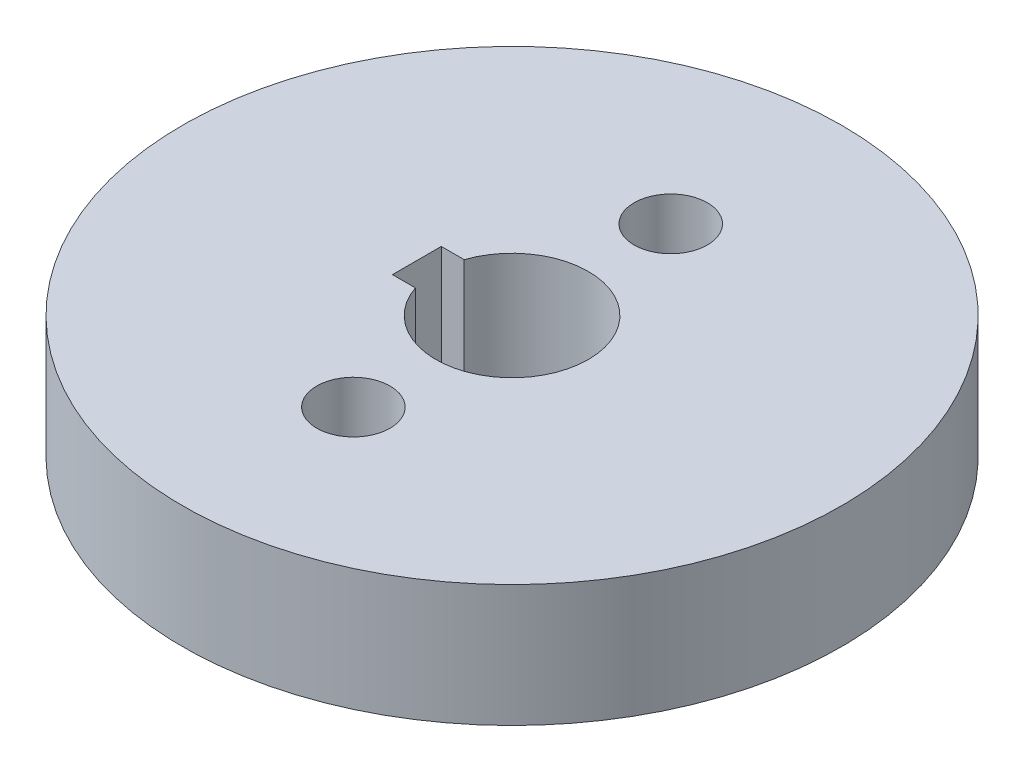
ISO-10303-21;
HEADER;
FILE_DESCRIPTION(('STEP AP214'),'2;1');
FILE_NAME('part.step','',(''),(''),'','','');
FILE_SCHEMA(('AUTOMOTIVE_DESIGN { 1 0 10303 214 1 1 1 1 }'));
ENDSEC;
DATA;
#1=APPLICATION_CONTEXT('core data for automotive mechanical design processes');
#2=APPLICATION_PROTOCOL_DEFINITION('international standard','automotive_design',2000,#1);
#3=PRODUCT_CONTEXT('',#1,'mechanical');
#4=PRODUCT('Part','Part','',(#3));
#5=PRODUCT_RELATED_PRODUCT_CATEGORY('part','',(#4));
#6=PRODUCT_DEFINITION_FORMATION('','',#4);
#7=PRODUCT_DEFINITION_CONTEXT('part definition',#1,'design');
#8=PRODUCT_DEFINITION('design','',#6,#7);
#9=PRODUCT_DEFINITION_SHAPE('','',#8);
#10=(LENGTH_UNIT() NAMED_UNIT(*) SI_UNIT(.MILLI.,.METRE.));
#11=(NAMED_UNIT(*) PLANE_ANGLE_UNIT() SI_UNIT($,.RADIAN.));
#12=(NAMED_UNIT(*) SI_UNIT($,.STERADIAN.) SOLID_ANGLE_UNIT());
#13=UNCERTAINTY_MEASURE_WITH_UNIT(LENGTH_MEASURE(1.E-05),#10,'distance_accuracy_value','');
#14=(GEOMETRIC_REPRESENTATION_CONTEXT(3) GLOBAL_UNCERTAINTY_ASSIGNED_CONTEXT((#13)) GLOBAL_UNIT_ASSIGNED_CONTEXT((#10,
#11,#12)) REPRESENTATION_CONTEXT('',''));
#15=CARTESIAN_POINT('',(0.,0.,0.));
#16=DIRECTION('',(0.,0.,1.));
#17=DIRECTION('',(1.,0.,0.));
#18=AXIS2_PLACEMENT_3D('',#15,#16,#17);
#19=CARTESIAN_POINT('',(0.,0.,0.));
#20=DIRECTION('',(0.,-1.,0.));
#21=DIRECTION('',(0.,0.,-1.));
#22=AXIS2_PLACEMENT_3D('',#19,#20,#21);
#23=CYLINDRICAL_SURFACE('',#22,54.);
#24=CARTESIAN_POINT('',(0.,20.,0.));
#25=DIRECTION('',(0.,-1.,0.));
#26=DIRECTION('',(0.,0.,-1.));
#27=AXIS2_PLACEMENT_3D('',#24,#25,#26);
#28=CIRCLE('',#27,54.);
#29=CARTESIAN_POINT('',(0.,20.,-54.));
#30=VERTEX_POINT('',#29);
#31=EDGE_CURVE('E11',#30,#30,#28,.T.);
#32=ORIENTED_EDGE('',*,*,#31,.T.);
#33=EDGE_LOOP('',(#32));
#34=FACE_BOUND('',#33,.T.);
#35=CARTESIAN_POINT('',(0.,0.,0.));
#36=DIRECTION('',(0.,-1.,0.));
#37=DIRECTION('',(0.,0.,-1.));
#38=AXIS2_PLACEMENT_3D('',#35,#36,#37);
#39=CIRCLE('',#38,54.);
#40=CARTESIAN_POINT('',(0.,0.,-54.));
#41=VERTEX_POINT('',#40);
#42=EDGE_CURVE('E97',#41,#41,#39,.T.);
#43=ORIENTED_EDGE('',*,*,#42,.F.);
#44=EDGE_LOOP('',(#43));
#45=FACE_BOUND('',#44,.T.);
#46=ADVANCED_FACE('F35',(#34,#45),#23,.T.);
#47=CARTESIAN_POINT('',(12.5,20.,0.));
#48=DIRECTION('',(0.,1.,0.));
#49=DIRECTION('',(0.,0.,1.));
#50=AXIS2_PLACEMENT_3D('',#47,#48,#49);
#51=PLANE('',#50);
#52=CARTESIAN_POINT('',(0.,20.,26.));
#53=DIRECTION('',(0.,1.,0.));
#54=DIRECTION('',(0.,0.,1.));
#55=AXIS2_PLACEMENT_3D('',#52,#53,#54);
#56=CIRCLE('',#55,6.);
#57=CARTESIAN_POINT('',(0.,20.,32.));
#58=VERTEX_POINT('',#57);
#59=EDGE_CURVE('E121',#58,#58,#56,.T.);
#60=ORIENTED_EDGE('',*,*,#59,.F.);
#61=EDGE_LOOP('',(#60));
#62=FACE_BOUND('',#61,.T.);
#63=DIRECTION('',(1.,0.,0.));
#64=VECTOR('',#63,1.);
#65=CARTESIAN_POINT('',(-15.6,20.,4.));
#66=LINE('',#65,#64);
#67=CARTESIAN_POINT('',(-15.6,20.,4.));
#68=VERTEX_POINT('',#67);
#69=CARTESIAN_POINT('',(-11.842719282327,20.,4.));
#70=VERTEX_POINT('',#69);
#71=EDGE_CURVE('E73',#68,#70,#66,.T.);
#72=ORIENTED_EDGE('',*,*,#71,.F.);
#73=DIRECTION('',(0.,0.,1.));
#74=VECTOR('',#73,1.);
#75=CARTESIAN_POINT('',(-15.6,20.,-4.));
#76=LINE('',#75,#74);
#77=CARTESIAN_POINT('',(-15.6,20.,-4.));
#78=VERTEX_POINT('',#77);
#79=EDGE_CURVE('E113',#78,#68,#76,.T.);
#80=ORIENTED_EDGE('',*,*,#79,.F.);
#81=DIRECTION('',(-1.,0.,0.));
#82=VECTOR('',#81,1.);
#83=CARTESIAN_POINT('',(-11.842719282327,20.,-4.));
#84=LINE('',#83,#82);
#85=CARTESIAN_POINT('',(-11.842719282327,20.,-4.));
#86=VERTEX_POINT('',#85);
#87=EDGE_CURVE('E116',#86,#78,#84,.T.);
#88=ORIENTED_EDGE('',*,*,#87,.F.);
#89=CARTESIAN_POINT('',(0.,20.,0.));
#90=DIRECTION('',(0.,-1.,0.));
#91=DIRECTION('',(0.,0.,-1.));
#92=AXIS2_PLACEMENT_3D('',#89,#90,#91);
#93=CIRCLE('',#92,12.5);
#94=EDGE_CURVE('E42',#86,#70,#93,.T.);
#95=ORIENTED_EDGE('',*,*,#94,.T.);
#96=EDGE_LOOP('',(#72,#80,#88,#95));
#97=FACE_BOUND('',#96,.T.);
#98=CARTESIAN_POINT('',(0.,20.,-26.));
#99=DIRECTION('',(0.,1.,0.));
#100=DIRECTION('',(0.,0.,1.));
#101=AXIS2_PLACEMENT_3D('',#98,#99,#100);
#102=CIRCLE('',#101,6.);
#103=CARTESIAN_POINT('',(0.,20.,-20.));
#104=VERTEX_POINT('',#103);
#105=EDGE_CURVE('E103',#104,#104,#102,.T.);
#106=ORIENTED_EDGE('',*,*,#105,.F.);
#107=EDGE_LOOP('',(#106));
#108=FACE_BOUND('',#107,.T.);
#109=ORIENTED_EDGE('',*,*,#31,.F.);
#110=EDGE_LOOP('',(#109));
#111=FACE_BOUND('',#110,.T.);
#112=ADVANCED_FACE('F134',(#62,#97,#108,#111),#51,.T.);
#113=CARTESIAN_POINT('',(0.,0.,0.));
#114=DIRECTION('',(0.,-1.,0.));
#115=DIRECTION('',(0.,0.,-1.));
#116=AXIS2_PLACEMENT_3D('',#113,#114,#115);
#117=CYLINDRICAL_SURFACE('',#116,12.5);
#118=DIRECTION('',(0.,1.,0.));
#119=VECTOR('',#118,1.);
#120=CARTESIAN_POINT('',(-11.842719282327,0.,4.));
#121=LINE('',#120,#119);
#122=CARTESIAN_POINT('',(-11.842719282327,0.,4.));
#123=VERTEX_POINT('',#122);
#124=EDGE_CURVE('E58',#123,#70,#121,.T.);
#125=ORIENTED_EDGE('',*,*,#124,.T.);
#126=ORIENTED_EDGE('',*,*,#94,.F.);
#127=DIRECTION('',(0.,1.,0.));
#128=VECTOR('',#127,1.);
#129=CARTESIAN_POINT('',(-11.842719282327,0.,-4.));
#130=LINE('',#129,#128);
#131=CARTESIAN_POINT('',(-11.842719282327,0.,-4.));
#132=VERTEX_POINT('',#131);
#133=EDGE_CURVE('E81',#132,#86,#130,.T.);
#134=ORIENTED_EDGE('',*,*,#133,.F.);
#135=CARTESIAN_POINT('',(0.,0.,0.));
#136=DIRECTION('',(0.,-1.,0.));
#137=DIRECTION('',(0.,0.,-1.));
#138=AXIS2_PLACEMENT_3D('',#135,#136,#137);
#139=CIRCLE('',#138,12.5);
#140=EDGE_CURVE('E91',#132,#123,#139,.T.);
#141=ORIENTED_EDGE('',*,*,#140,.T.);
#142=EDGE_LOOP('',(#125,#126,#134,#141));
#143=FACE_BOUND('',#142,.T.);
#144=ADVANCED_FACE('F90',(#143),#117,.F.);
#145=CARTESIAN_POINT('',(12.5,0.,0.));
#146=DIRECTION('',(0.,-1.,0.));
#147=DIRECTION('',(0.,0.,-1.));
#148=AXIS2_PLACEMENT_3D('',#145,#146,#147);
#149=PLANE('',#148);
#150=CARTESIAN_POINT('',(0.,0.,26.));
#151=DIRECTION('',(0.,1.,0.));
#152=DIRECTION('',(0.,0.,1.));
#153=AXIS2_PLACEMENT_3D('',#150,#151,#152);
#154=CIRCLE('',#153,6.);
#155=CARTESIAN_POINT('',(0.,0.,32.));
#156=VERTEX_POINT('',#155);
#157=EDGE_CURVE('E118',#156,#156,#154,.T.);
#158=ORIENTED_EDGE('',*,*,#157,.T.);
#159=EDGE_LOOP('',(#158));
#160=FACE_BOUND('',#159,.T.);
#161=DIRECTION('',(1.,0.,0.));
#162=VECTOR('',#161,1.);
#163=CARTESIAN_POINT('',(-15.6,0.,4.));
#164=LINE('',#163,#162);
#165=CARTESIAN_POINT('',(-15.6,0.,4.));
#166=VERTEX_POINT('',#165);
#167=EDGE_CURVE('E93',#166,#123,#164,.T.);
#168=ORIENTED_EDGE('',*,*,#167,.T.);
#169=ORIENTED_EDGE('',*,*,#140,.F.);
#170=DIRECTION('',(-1.,0.,0.));
#171=VECTOR('',#170,1.);
#172=CARTESIAN_POINT('',(-11.842719282327,0.,-4.));
#173=LINE('',#172,#171);
#174=CARTESIAN_POINT('',(-15.6,0.,-4.));
#175=VERTEX_POINT('',#174);
#176=EDGE_CURVE('E77',#132,#175,#173,.T.);
#177=ORIENTED_EDGE('',*,*,#176,.T.);
#178=DIRECTION('',(0.,0.,1.));
#179=VECTOR('',#178,1.);
#180=CARTESIAN_POINT('',(-15.6,0.,-4.));
#181=LINE('',#180,#179);
#182=EDGE_CURVE('E49',#175,#166,#181,.T.);
#183=ORIENTED_EDGE('',*,*,#182,.T.);
#184=EDGE_LOOP('',(#168,#169,#177,#183));
#185=FACE_BOUND('',#184,.T.);
#186=CARTESIAN_POINT('',(0.,0.,-26.));
#187=DIRECTION('',(0.,1.,0.));
#188=DIRECTION('',(0.,0.,1.));
#189=AXIS2_PLACEMENT_3D('',#186,#187,#188);
#190=CIRCLE('',#189,6.);
#191=CARTESIAN_POINT('',(0.,0.,-20.));
#192=VERTEX_POINT('',#191);
#193=EDGE_CURVE('E100',#192,#192,#190,.T.);
#194=ORIENTED_EDGE('',*,*,#193,.T.);
#195=EDGE_LOOP('',(#194));
#196=FACE_BOUND('',#195,.T.);
#197=ORIENTED_EDGE('',*,*,#42,.T.);
#198=EDGE_LOOP('',(#197));
#199=FACE_BOUND('',#198,.T.);
#200=ADVANCED_FACE('F95',(#160,#185,#196,#199),#149,.T.);
#201=CARTESIAN_POINT('',(0.,0.,-26.));
#202=DIRECTION('',(0.,1.,0.));
#203=DIRECTION('',(0.,0.,1.));
#204=AXIS2_PLACEMENT_3D('',#201,#202,#203);
#205=CYLINDRICAL_SURFACE('',#204,6.);
#206=ORIENTED_EDGE('',*,*,#193,.F.);
#207=EDGE_LOOP('',(#206));
#208=FACE_BOUND('',#207,.T.);
#209=ORIENTED_EDGE('',*,*,#105,.T.);
#210=EDGE_LOOP('',(#209));
#211=FACE_BOUND('',#210,.T.);
#212=ADVANCED_FACE('F148',(#208,#211),#205,.F.);
#213=CARTESIAN_POINT('',(-15.6,0.,4.));
#214=DIRECTION('',(0.,0.,1.));
#215=DIRECTION('',(1.,0.,0.));
#216=AXIS2_PLACEMENT_3D('',#213,#214,#215);
#217=PLANE('',#216);
#218=ORIENTED_EDGE('',*,*,#71,.T.);
#219=ORIENTED_EDGE('',*,*,#124,.F.);
#220=ORIENTED_EDGE('',*,*,#167,.F.);
#221=DIRECTION('',(0.,1.,0.));
#222=VECTOR('',#221,1.);
#223=CARTESIAN_POINT('',(-15.6,0.,4.));
#224=LINE('',#223,#222);
#225=EDGE_CURVE('E109',#166,#68,#224,.T.);
#226=ORIENTED_EDGE('',*,*,#225,.T.);
#227=EDGE_LOOP('',(#218,#219,#220,#226));
#228=FACE_BOUND('',#227,.T.);
#229=ADVANCED_FACE('F154',(#228),#217,.F.);
#230=CARTESIAN_POINT('',(-15.6,0.,-4.));
#231=DIRECTION('',(-1.,0.,0.));
#232=DIRECTION('',(0.,0.,1.));
#233=AXIS2_PLACEMENT_3D('',#230,#231,#232);
#234=PLANE('',#233);
#235=ORIENTED_EDGE('',*,*,#79,.T.);
#236=ORIENTED_EDGE('',*,*,#225,.F.);
#237=ORIENTED_EDGE('',*,*,#182,.F.);
#238=DIRECTION('',(0.,1.,0.));
#239=VECTOR('',#238,1.);
#240=CARTESIAN_POINT('',(-15.6,0.,-4.));
#241=LINE('',#240,#239);
#242=EDGE_CURVE('E83',#175,#78,#241,.T.);
#243=ORIENTED_EDGE('',*,*,#242,.T.);
#244=EDGE_LOOP('',(#235,#236,#237,#243));
#245=FACE_BOUND('',#244,.T.);
#246=ADVANCED_FACE('F161',(#245),#234,.F.);
#247=CARTESIAN_POINT('',(-11.842719282327,0.,-4.));
#248=DIRECTION('',(0.,0.,-1.));
#249=DIRECTION('',(-1.,0.,0.));
#250=AXIS2_PLACEMENT_3D('',#247,#248,#249);
#251=PLANE('',#250);
#252=ORIENTED_EDGE('',*,*,#87,.T.);
#253=ORIENTED_EDGE('',*,*,#242,.F.);
#254=ORIENTED_EDGE('',*,*,#176,.F.);
#255=ORIENTED_EDGE('',*,*,#133,.T.);
#256=EDGE_LOOP('',(#252,#253,#254,#255));
#257=FACE_BOUND('',#256,.T.);
#258=ADVANCED_FACE('F80',(#257),#251,.F.);
#259=CARTESIAN_POINT('',(0.,0.,26.));
#260=DIRECTION('',(0.,1.,0.));
#261=DIRECTION('',(0.,0.,1.));
#262=AXIS2_PLACEMENT_3D('',#259,#260,#261);
#263=CYLINDRICAL_SURFACE('',#262,6.);
#264=ORIENTED_EDGE('',*,*,#157,.F.);
#265=EDGE_LOOP('',(#264));
#266=FACE_BOUND('',#265,.T.);
#267=ORIENTED_EDGE('',*,*,#59,.T.);
#268=EDGE_LOOP('',(#267));
#269=FACE_BOUND('',#268,.T.);
#270=ADVANCED_FACE('F128',(#266,#269),#263,.F.);
#271=CLOSED_SHELL('',(#46,#112,#144,#200,#212,#229,#246,#258,#270));
#272=MANIFOLD_SOLID_BREP('B2',#271);
#273=ADVANCED_BREP_SHAPE_REPRESENTATION('',(#18,#272),#14);
#274=SHAPE_DEFINITION_REPRESENTATION(#9,#273);
ENDSEC;
END-ISO-10303-21;
